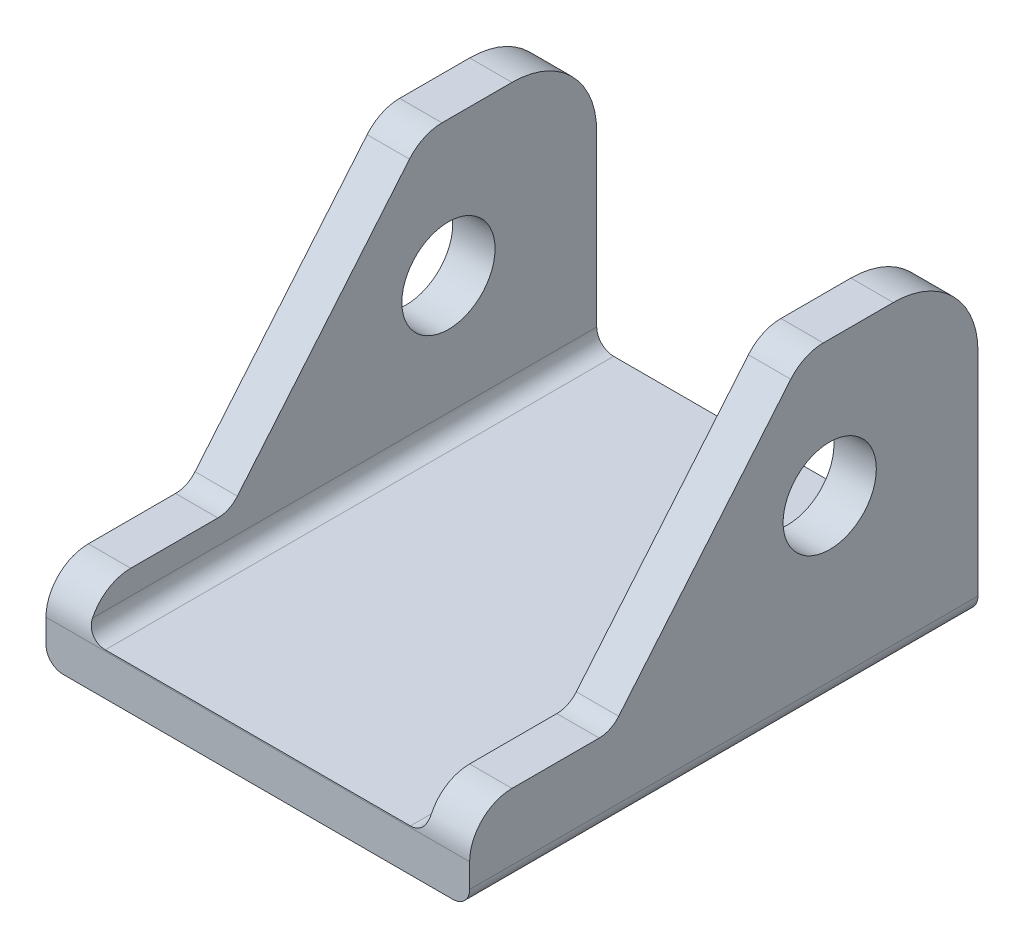
ISO-10303-21;
HEADER;
FILE_DESCRIPTION(('STEP AP214'),'2;1');
FILE_NAME('part.step','',(''),(''),'','','');
FILE_SCHEMA(('AUTOMOTIVE_DESIGN { 1 0 10303 214 1 1 1 1 }'));
ENDSEC;
DATA;
#1=APPLICATION_CONTEXT('core data for automotive mechanical design processes');
#2=APPLICATION_PROTOCOL_DEFINITION('international standard','automotive_design',2000,#1);
#3=PRODUCT_CONTEXT('',#1,'mechanical');
#4=PRODUCT('Part','Part','',(#3));
#5=PRODUCT_RELATED_PRODUCT_CATEGORY('part','',(#4));
#6=PRODUCT_DEFINITION_FORMATION('','',#4);
#7=PRODUCT_DEFINITION_CONTEXT('part definition',#1,'design');
#8=PRODUCT_DEFINITION('design','',#6,#7);
#9=PRODUCT_DEFINITION_SHAPE('','',#8);
#10=(LENGTH_UNIT() NAMED_UNIT(*) SI_UNIT(.MILLI.,.METRE.));
#11=(NAMED_UNIT(*) PLANE_ANGLE_UNIT() SI_UNIT($,.RADIAN.));
#12=(NAMED_UNIT(*) SI_UNIT($,.STERADIAN.) SOLID_ANGLE_UNIT());
#13=UNCERTAINTY_MEASURE_WITH_UNIT(LENGTH_MEASURE(1.E-05),#10,'distance_accuracy_value','');
#14=(GEOMETRIC_REPRESENTATION_CONTEXT(3) GLOBAL_UNCERTAINTY_ASSIGNED_CONTEXT((#13)) GLOBAL_UNIT_ASSIGNED_CONTEXT((#10,
#11,#12)) REPRESENTATION_CONTEXT('',''));
#15=CARTESIAN_POINT('',(0.,0.,0.));
#16=DIRECTION('',(0.,0.,1.));
#17=DIRECTION('',(1.,0.,0.));
#18=AXIS2_PLACEMENT_3D('',#15,#16,#17);
#19=CARTESIAN_POINT('',(-93.9251910485441,-11.2481336624736,60.));
#20=DIRECTION('',(1.,0.,0.));
#21=DIRECTION('',(0.,0.,-1.));
#22=AXIS2_PLACEMENT_3D('',#19,#20,#21);
#23=PLANE('',#22);
#24=CARTESIAN_POINT('',(-93.9251910485441,7.75186633752635,17.5));
#25=DIRECTION('',(1.,0.,0.));
#26=DIRECTION('',(0.,0.,-1.));
#27=AXIS2_PLACEMENT_3D('',#24,#25,#26);
#28=CIRCLE('',#27,5.5);
#29=CARTESIAN_POINT('',(-93.9251910485441,7.75186633752635,12.));
#30=VERTEX_POINT('',#29);
#31=EDGE_CURVE('E338',#30,#30,#28,.T.);
#32=ORIENTED_EDGE('',*,*,#31,.T.);
#33=EDGE_LOOP('',(#32));
#34=FACE_BOUND('',#33,.T.);
#35=CARTESIAN_POINT('',(-93.9251910485441,18.7518663375264,18.2638664890412));
#36=DIRECTION('',(1.,0.,0.));
#37=DIRECTION('',(0.,0.,-1.));
#38=AXIS2_PLACEMENT_3D('',#35,#36,#37);
#39=CIRCLE('',#38,5.);
#40=CARTESIAN_POINT('',(-93.9251910485441,23.7518663375264,18.2638664890412));
#41=VERTEX_POINT('',#40);
#42=CARTESIAN_POINT('',(-93.9251910485441,21.9591391649979,22.0996716209741));
#43=VERTEX_POINT('',#42);
#44=EDGE_CURVE('E332',#41,#43,#39,.T.);
#45=ORIENTED_EDGE('',*,*,#44,.F.);
#46=DIRECTION('',(0.,0.,-1.));
#47=VECTOR('',#46,1.);
#48=CARTESIAN_POINT('',(-93.9251910485441,23.7518663375264,60.));
#49=LINE('',#48,#47);
#50=CARTESIAN_POINT('',(-93.9251910485441,23.7518663375264,10.));
#51=VERTEX_POINT('',#50);
#52=EDGE_CURVE('E413',#41,#51,#49,.T.);
#53=ORIENTED_EDGE('',*,*,#52,.T.);
#54=CARTESIAN_POINT('',(-93.9251910485441,13.7518663375263,10.));
#55=DIRECTION('',(1.,0.,0.));
#56=DIRECTION('',(0.,0.,-1.));
#57=AXIS2_PLACEMENT_3D('',#54,#55,#56);
#58=CIRCLE('',#57,10.);
#59=CARTESIAN_POINT('',(-93.9251910485441,13.7518663375263,0.));
#60=VERTEX_POINT('',#59);
#61=EDGE_CURVE('E311',#51,#60,#58,.F.);
#62=ORIENTED_EDGE('',*,*,#61,.T.);
#63=DIRECTION('',(0.,-1.,0.));
#64=VECTOR('',#63,1.);
#65=CARTESIAN_POINT('',(-93.9251910485441,-11.2481336624736,0.));
#66=LINE('',#65,#64);
#67=CARTESIAN_POINT('',(-93.9251910485441,-11.2481336624736,0.));
#68=VERTEX_POINT('',#67);
#69=EDGE_CURVE('E351',#60,#68,#66,.T.);
#70=ORIENTED_EDGE('',*,*,#69,.T.);
#71=DIRECTION('',(0.,0.,-1.));
#72=VECTOR('',#71,1.);
#73=CARTESIAN_POINT('',(-93.9251910485441,-11.2481336624736,60.));
#74=LINE('',#73,#72);
#75=CARTESIAN_POINT('',(-93.9251910485441,-11.2481336624736,60.));
#76=VERTEX_POINT('',#75);
#77=EDGE_CURVE('E410',#76,#68,#74,.T.);
#78=ORIENTED_EDGE('',*,*,#77,.F.);
#79=DIRECTION('',(0.,-1.,0.));
#80=VECTOR('',#79,1.);
#81=CARTESIAN_POINT('',(-93.9251910485441,-11.2481336624736,60.));
#82=LINE('',#81,#80);
#83=CARTESIAN_POINT('',(-93.9251910485441,-8.40963792703764,60.));
#84=VERTEX_POINT('',#83);
#85=EDGE_CURVE('E352',#84,#76,#82,.T.);
#86=ORIENTED_EDGE('',*,*,#85,.F.);
#87=CARTESIAN_POINT('',(-93.9251910485441,-8.40963792703764,55.));
#88=DIRECTION('',(1.,0.,0.));
#89=DIRECTION('',(0.,0.,-1.));
#90=AXIS2_PLACEMENT_3D('',#87,#88,#89);
#91=CIRCLE('',#90,5.);
#92=CARTESIAN_POINT('',(-93.9251910485441,-3.40963792703763,55.));
#93=VERTEX_POINT('',#92);
#94=EDGE_CURVE('E433',#93,#84,#91,.T.);
#95=ORIENTED_EDGE('',*,*,#94,.F.);
#96=DIRECTION('',(0.,0.,1.));
#97=VECTOR('',#96,1.);
#98=CARTESIAN_POINT('',(-93.9251910485441,-3.40963792703763,60.));
#99=LINE('',#98,#97);
#100=CARTESIAN_POINT('',(-93.9251910485441,-3.40963792703763,44.7136386937328));
#101=VERTEX_POINT('',#100);
#102=EDGE_CURVE('E194',#101,#93,#99,.T.);
#103=ORIENTED_EDGE('',*,*,#102,.F.);
#104=CARTESIAN_POINT('',(-93.9251910485441,-0.409637927037632,44.7136386937328));
#105=DIRECTION('',(1.,0.,0.));
#106=DIRECTION('',(0.,0.,-1.));
#107=AXIS2_PLACEMENT_3D('',#104,#105,#106);
#108=CIRCLE('',#107,3.);
#109=CARTESIAN_POINT('',(-93.9251910485441,-2.33400162352049,42.4121556145731));
#110=VERTEX_POINT('',#109);
#111=EDGE_CURVE('E37',#110,#101,#108,.F.);
#112=ORIENTED_EDGE('',*,*,#111,.F.);
#113=DIRECTION('',(0.,-0.767161026386595,0.641454565494289));
#114=VECTOR('',#113,1.);
#115=CARTESIAN_POINT('',(-93.9251910485441,-16.2352492263774,54.0355546588638));
#116=LINE('',#115,#114);
#117=EDGE_CURVE('E32',#43,#110,#116,.T.);
#118=ORIENTED_EDGE('',*,*,#117,.F.);
#119=EDGE_LOOP('',(#45,#53,#62,#70,#78,#86,#95,#103,#112,#118));
#120=FACE_BOUND('',#119,.T.);
#121=ADVANCED_FACE('F17',(#34,#120),#23,.F.);
#122=CARTESIAN_POINT('',(-43.9251910485441,-11.2481336624736,60.));
#123=DIRECTION('',(-1.,0.,0.));
#124=DIRECTION('',(0.,0.,1.));
#125=AXIS2_PLACEMENT_3D('',#122,#123,#124);
#126=PLANE('',#125);
#127=CARTESIAN_POINT('',(-43.9251910485441,7.75186633752635,17.5));
#128=DIRECTION('',(1.,0.,0.));
#129=DIRECTION('',(0.,0.,-1.));
#130=AXIS2_PLACEMENT_3D('',#127,#128,#129);
#131=CIRCLE('',#130,5.5);
#132=CARTESIAN_POINT('',(-43.9251910485441,7.75186633752635,12.));
#133=VERTEX_POINT('',#132);
#134=EDGE_CURVE('E334',#133,#133,#131,.T.);
#135=ORIENTED_EDGE('',*,*,#134,.F.);
#136=EDGE_LOOP('',(#135));
#137=FACE_BOUND('',#136,.T.);
#138=CARTESIAN_POINT('',(-43.9251910485441,18.7518663375264,18.2638664890412));
#139=DIRECTION('',(-1.,0.,0.));
#140=DIRECTION('',(0.,0.,1.));
#141=AXIS2_PLACEMENT_3D('',#138,#139,#140);
#142=CIRCLE('',#141,5.);
#143=CARTESIAN_POINT('',(-43.9251910485441,21.9591391649979,22.0996716209741));
#144=VERTEX_POINT('',#143);
#145=CARTESIAN_POINT('',(-43.9251910485441,23.7518663375264,18.2638664890412));
#146=VERTEX_POINT('',#145);
#147=EDGE_CURVE('E335',#144,#146,#142,.T.);
#148=ORIENTED_EDGE('',*,*,#147,.F.);
#149=DIRECTION('',(0.,0.767161026386595,-0.641454565494289));
#150=VECTOR('',#149,1.);
#151=CARTESIAN_POINT('',(-43.9251910485441,-16.2352492263774,54.0355546588638));
#152=LINE('',#151,#150);
#153=CARTESIAN_POINT('',(-43.9251910485441,-2.33400162352049,42.4121556145731));
#154=VERTEX_POINT('',#153);
#155=EDGE_CURVE('E453',#154,#144,#152,.T.);
#156=ORIENTED_EDGE('',*,*,#155,.F.);
#157=CARTESIAN_POINT('',(-43.9251910485441,-0.409637927037632,44.7136386937328));
#158=DIRECTION('',(-1.,0.,0.));
#159=DIRECTION('',(0.,0.,1.));
#160=AXIS2_PLACEMENT_3D('',#157,#158,#159);
#161=CIRCLE('',#160,3.);
#162=CARTESIAN_POINT('',(-43.9251910485441,-3.40963792703763,44.7136386937328));
#163=VERTEX_POINT('',#162);
#164=EDGE_CURVE('E446',#163,#154,#161,.F.);
#165=ORIENTED_EDGE('',*,*,#164,.F.);
#166=DIRECTION('',(0.,0.,-1.));
#167=VECTOR('',#166,1.);
#168=CARTESIAN_POINT('',(-43.9251910485441,-3.40963792703763,60.));
#169=LINE('',#168,#167);
#170=CARTESIAN_POINT('',(-43.9251910485441,-3.40963792703763,55.));
#171=VERTEX_POINT('',#170);
#172=EDGE_CURVE('E439',#171,#163,#169,.T.);
#173=ORIENTED_EDGE('',*,*,#172,.F.);
#174=CARTESIAN_POINT('',(-43.9251910485441,-8.40963792703764,55.));
#175=DIRECTION('',(-1.,0.,0.));
#176=DIRECTION('',(0.,0.,1.));
#177=AXIS2_PLACEMENT_3D('',#174,#175,#176);
#178=CIRCLE('',#177,5.);
#179=CARTESIAN_POINT('',(-43.9251910485441,-8.40963792703764,60.));
#180=VERTEX_POINT('',#179);
#181=EDGE_CURVE('E432',#180,#171,#178,.T.);
#182=ORIENTED_EDGE('',*,*,#181,.F.);
#183=DIRECTION('',(0.,1.,0.));
#184=VECTOR('',#183,1.);
#185=CARTESIAN_POINT('',(-43.9251910485441,-11.2481336624736,60.));
#186=LINE('',#185,#184);
#187=CARTESIAN_POINT('',(-43.9251910485441,-11.2481336624736,60.));
#188=VERTEX_POINT('',#187);
#189=EDGE_CURVE('E361',#188,#180,#186,.T.);
#190=ORIENTED_EDGE('',*,*,#189,.F.);
#191=DIRECTION('',(0.,0.,-1.));
#192=VECTOR('',#191,1.);
#193=CARTESIAN_POINT('',(-43.9251910485441,-11.2481336624736,60.));
#194=LINE('',#193,#192);
#195=CARTESIAN_POINT('',(-43.9251910485441,-11.2481336624736,0.));
#196=VERTEX_POINT('',#195);
#197=EDGE_CURVE('E401',#188,#196,#194,.T.);
#198=ORIENTED_EDGE('',*,*,#197,.T.);
#199=DIRECTION('',(0.,1.,0.));
#200=VECTOR('',#199,1.);
#201=CARTESIAN_POINT('',(-43.9251910485441,-11.2481336624736,0.));
#202=LINE('',#201,#200);
#203=CARTESIAN_POINT('',(-43.9251910485441,13.7518663375263,0.));
#204=VERTEX_POINT('',#203);
#205=EDGE_CURVE('E372',#196,#204,#202,.T.);
#206=ORIENTED_EDGE('',*,*,#205,.T.);
#207=CARTESIAN_POINT('',(-43.9251910485441,13.7518663375263,10.));
#208=DIRECTION('',(-1.,0.,0.));
#209=DIRECTION('',(0.,0.,1.));
#210=AXIS2_PLACEMENT_3D('',#207,#208,#209);
#211=CIRCLE('',#210,10.);
#212=CARTESIAN_POINT('',(-43.9251910485441,23.7518663375264,10.));
#213=VERTEX_POINT('',#212);
#214=EDGE_CURVE('E300',#204,#213,#211,.F.);
#215=ORIENTED_EDGE('',*,*,#214,.T.);
#216=DIRECTION('',(0.,0.,-1.));
#217=VECTOR('',#216,1.);
#218=CARTESIAN_POINT('',(-43.9251910485441,23.7518663375264,60.));
#219=LINE('',#218,#217);
#220=EDGE_CURVE('E399',#146,#213,#219,.T.);
#221=ORIENTED_EDGE('',*,*,#220,.F.);
#222=EDGE_LOOP('',(#148,#156,#165,#173,#182,#190,#198,#206,#215,#221));
#223=FACE_BOUND('',#222,.T.);
#224=ADVANCED_FACE('F252',(#137,#223),#126,.F.);
#225=CARTESIAN_POINT('',(-48.9251910485441,-6.24813366247364,60.));
#226=DIRECTION('',(1.,0.,0.));
#227=DIRECTION('',(0.,0.,-1.));
#228=AXIS2_PLACEMENT_3D('',#225,#226,#227);
#229=PLANE('',#228);
#230=CARTESIAN_POINT('',(-48.9251910485441,7.75186633752635,17.5));
#231=DIRECTION('',(1.,0.,0.));
#232=DIRECTION('',(0.,0.,-1.));
#233=AXIS2_PLACEMENT_3D('',#230,#231,#232);
#234=CIRCLE('',#233,5.5);
#235=CARTESIAN_POINT('',(-48.9251910485441,7.75186633752635,12.));
#236=VERTEX_POINT('',#235);
#237=EDGE_CURVE('E347',#236,#236,#234,.T.);
#238=ORIENTED_EDGE('',*,*,#237,.T.);
#239=EDGE_LOOP('',(#238));
#240=FACE_BOUND('',#239,.T.);
#241=CARTESIAN_POINT('',(-48.9251910485441,18.7518663375264,18.2638664890412));
#242=DIRECTION('',(1.,0.,0.));
#243=DIRECTION('',(0.,0.,-1.));
#244=AXIS2_PLACEMENT_3D('',#241,#242,#243);
#245=CIRCLE('',#244,5.);
#246=CARTESIAN_POINT('',(-48.9251910485441,23.7518663375264,18.2638664890412));
#247=VERTEX_POINT('',#246);
#248=CARTESIAN_POINT('',(-48.9251910485441,21.9591391649979,22.0996716209741));
#249=VERTEX_POINT('',#248);
#250=EDGE_CURVE('E341',#247,#249,#245,.T.);
#251=ORIENTED_EDGE('',*,*,#250,.F.);
#252=DIRECTION('',(0.,0.,-1.));
#253=VECTOR('',#252,1.);
#254=CARTESIAN_POINT('',(-48.9251910485441,23.7518663375264,60.));
#255=LINE('',#254,#253);
#256=CARTESIAN_POINT('',(-48.9251910485441,23.7518663375264,10.));
#257=VERTEX_POINT('',#256);
#258=EDGE_CURVE('E397',#247,#257,#255,.T.);
#259=ORIENTED_EDGE('',*,*,#258,.T.);
#260=CARTESIAN_POINT('',(-48.9251910485441,13.7518663375263,10.));
#261=DIRECTION('',(1.,0.,0.));
#262=DIRECTION('',(0.,0.,-1.));
#263=AXIS2_PLACEMENT_3D('',#260,#261,#262);
#264=CIRCLE('',#263,10.);
#265=CARTESIAN_POINT('',(-48.9251910485441,13.7518663375263,0.));
#266=VERTEX_POINT('',#265);
#267=EDGE_CURVE('E313',#257,#266,#264,.F.);
#268=ORIENTED_EDGE('',*,*,#267,.T.);
#269=DIRECTION('',(0.,-1.,0.));
#270=VECTOR('',#269,1.);
#271=CARTESIAN_POINT('',(-48.9251910485441,-6.24813366247364,0.));
#272=LINE('',#271,#270);
#273=CARTESIAN_POINT('',(-48.9251910485441,-6.24813366247365,0.));
#274=VERTEX_POINT('',#273);
#275=EDGE_CURVE('E374',#266,#274,#272,.T.);
#276=ORIENTED_EDGE('',*,*,#275,.T.);
#277=DIRECTION('',(0.,0.,-1.));
#278=VECTOR('',#277,1.);
#279=CARTESIAN_POINT('',(-48.9251910485441,-6.24813366247365,60.));
#280=LINE('',#279,#278);
#281=CARTESIAN_POINT('',(-48.9251910485441,-6.24813366247365,59.5086471711892));
#282=VERTEX_POINT('',#281);
#283=EDGE_CURVE('E395',#282,#274,#280,.T.);
#284=ORIENTED_EDGE('',*,*,#283,.F.);
#285=CARTESIAN_POINT('',(-48.9251910485441,-8.40963792703764,55.));
#286=DIRECTION('',(1.,0.,0.));
#287=DIRECTION('',(0.,0.,-1.));
#288=AXIS2_PLACEMENT_3D('',#285,#286,#287);
#289=CIRCLE('',#288,5.);
#290=CARTESIAN_POINT('',(-48.9251910485441,-3.40963792703763,55.));
#291=VERTEX_POINT('',#290);
#292=EDGE_CURVE('E241',#291,#282,#289,.T.);
#293=ORIENTED_EDGE('',*,*,#292,.F.);
#294=DIRECTION('',(0.,0.,1.));
#295=VECTOR('',#294,1.);
#296=CARTESIAN_POINT('',(-48.9251910485441,-3.40963792703763,60.));
#297=LINE('',#296,#295);
#298=CARTESIAN_POINT('',(-48.9251910485441,-3.40963792703763,44.7136386937328));
#299=VERTEX_POINT('',#298);
#300=EDGE_CURVE('E435',#299,#291,#297,.T.);
#301=ORIENTED_EDGE('',*,*,#300,.F.);
#302=CARTESIAN_POINT('',(-48.9251910485441,-0.409637927037632,44.7136386937328));
#303=DIRECTION('',(1.,0.,0.));
#304=DIRECTION('',(0.,0.,-1.));
#305=AXIS2_PLACEMENT_3D('',#302,#303,#304);
#306=CIRCLE('',#305,3.);
#307=CARTESIAN_POINT('',(-48.9251910485441,-2.33400162352049,42.4121556145731));
#308=VERTEX_POINT('',#307);
#309=EDGE_CURVE('E443',#308,#299,#306,.F.);
#310=ORIENTED_EDGE('',*,*,#309,.F.);
#311=DIRECTION('',(0.,-0.767161026386595,0.641454565494289));
#312=VECTOR('',#311,1.);
#313=CARTESIAN_POINT('',(-48.9251910485441,-13.2925690243447,51.575059944639));
#314=LINE('',#313,#312);
#315=EDGE_CURVE('E450',#249,#308,#314,.T.);
#316=ORIENTED_EDGE('',*,*,#315,.F.);
#317=EDGE_LOOP('',(#251,#259,#268,#276,#284,#293,#301,#310,#316));
#318=FACE_BOUND('',#317,.T.);
#319=ADVANCED_FACE('F248',(#240,#318),#229,.F.);
#320=CARTESIAN_POINT('',(-50.9251910485441,-6.24813366247365,60.));
#321=DIRECTION('',(0.,0.,-1.));
#322=DIRECTION('',(-1.,0.,0.));
#323=AXIS2_PLACEMENT_3D('',#320,#321,#322);
#324=CYLINDRICAL_SURFACE('',#323,2.);
#325=CARTESIAN_POINT('',(-48.9251910485441,-6.24813366247365,59.5086471711892));
#326=CARTESIAN_POINT('',(-48.9251858279575,-6.29925158291448,59.5331623247386));
#327=CARTESIAN_POINT('',(-48.9271512068707,-6.35080301802409,59.5567990272245));
#328=CARTESIAN_POINT('',(-48.9351813542254,-6.45443177630553,59.602211528082));
#329=CARTESIAN_POINT('',(-48.9412481172607,-6.50650934320255,59.6239864152047));
#330=CARTESIAN_POINT('',(-48.9576482900265,-6.61085446674959,59.6655693990258));
#331=CARTESIAN_POINT('',(-48.9679862513358,-6.66312216693958,59.6853753695408));
#332=CARTESIAN_POINT('',(-48.9930137289147,-6.76733290544828,59.7229131946399));
#333=CARTESIAN_POINT('',(-49.0077024703024,-6.81927599989918,59.7406454177785));
#334=CARTESIAN_POINT('',(-49.0585115706969,-6.97430059994172,59.7907790495722));
#335=CARTESIAN_POINT('',(-49.1013362318181,-7.07632240709125,59.8200169471264));
#336=CARTESIAN_POINT('',(-49.2042792554828,-7.27322030647919,59.8702058638572));
#337=CARTESIAN_POINT('',(-49.2643756509398,-7.36810528350626,59.8911673295423));
#338=CARTESIAN_POINT('',(-49.3970308688227,-7.54279772429904,59.9250504742515));
#339=CARTESIAN_POINT('',(-49.4688265198361,-7.62311873332182,59.9383184475654));
#340=CARTESIAN_POINT('',(-49.6248376640662,-7.77151129368797,59.9596805565256));
#341=CARTESIAN_POINT('',(-49.7090594765108,-7.83957657313861,59.9677720484745));
#342=CARTESIAN_POINT('',(-49.8881051774762,-7.96168873087448,59.9802757420668));
#343=CARTESIAN_POINT('',(-49.982990863911,-8.01564716216322,59.9846650966699));
#344=CARTESIAN_POINT('',(-50.1803233596858,-8.1074372234226,59.9910713392174));
#345=CARTESIAN_POINT('',(-50.2827684441001,-8.14527251915008,59.993088766627));
#346=CARTESIAN_POINT('',(-50.4749979127184,-8.19891859416786,59.9956202169407));
#347=CARTESIAN_POINT('',(-50.5640614480152,-8.21734265358092,59.9963281951281));
#348=CARTESIAN_POINT('',(-50.7438048210362,-8.24196347177262,59.9971908023903));
#349=CARTESIAN_POINT('',(-50.8344835569718,-8.24816826602772,59.9973457951667));
#350=CARTESIAN_POINT('',(-50.9251910485441,-8.24813366247365,59.997390956542));
#351=B_SPLINE_CURVE_WITH_KNOTS('',3,(#325,#326,#327,#328,#329,#330,#331,#332,#333,#334,#335,
#336,#337,#338,#339,#340,#341,#342,#343,#344,#345,#346,#347,#348,#349,#350),.UNSPECIFIED.,.F.,
.F.,(4,2,2,2,2,2,2,2,2,2,2,2,4),(0.,0.170050316121905,0.340183391021309,0.510498236842742,
0.680782767500124,1.02217120620495,1.36312735645558,1.6872241414251,2.0114863150445,
2.3377352664318,2.66391000221573,2.93594663159864,3.20780430792562),.UNSPECIFIED.);
#352=CARTESIAN_POINT('',(-50.9251910485441,-8.24813366247365,59.997390956542));
#353=VERTEX_POINT('',#352);
#354=EDGE_CURVE('E233',#282,#353,#351,.T.);
#355=ORIENTED_EDGE('',*,*,#354,.F.);
#356=ORIENTED_EDGE('',*,*,#283,.T.);
#357=CARTESIAN_POINT('',(-50.9251910485441,-6.24813366247365,0.));
#358=DIRECTION('',(0.,0.,-1.));
#359=DIRECTION('',(1.,0.,0.));
#360=AXIS2_PLACEMENT_3D('',#357,#358,#359);
#361=CIRCLE('',#360,2.);
#362=CARTESIAN_POINT('',(-50.9251910485441,-8.24813366247365,0.));
#363=VERTEX_POINT('',#362);
#364=EDGE_CURVE('E377',#274,#363,#361,.T.);
#365=ORIENTED_EDGE('',*,*,#364,.T.);
#366=DIRECTION('',(0.,0.,-1.));
#367=VECTOR('',#366,1.);
#368=CARTESIAN_POINT('',(-50.9251910485441,-8.24813366247365,60.));
#369=LINE('',#368,#367);
#370=EDGE_CURVE('E393',#353,#363,#369,.T.);
#371=ORIENTED_EDGE('',*,*,#370,.F.);
#372=EDGE_LOOP('',(#355,#356,#365,#371));
#373=FACE_BOUND('',#372,.T.);
#374=ADVANCED_FACE('F243',(#373),#324,.F.);
#375=CARTESIAN_POINT('',(-86.9251910485441,-8.24813366247365,60.));
#376=DIRECTION('',(0.,-1.,0.));
#377=DIRECTION('',(0.,0.,-1.));
#378=AXIS2_PLACEMENT_3D('',#375,#376,#377);
#379=PLANE('',#378);
#380=DIRECTION('',(1.,0.,0.));
#381=VECTOR('',#380,1.);
#382=CARTESIAN_POINT('',(-201.954411632607,-8.24813366247365,59.997390956542));
#383=LINE('',#382,#381);
#384=CARTESIAN_POINT('',(-86.9251910485441,-8.24813366247365,59.997390956542));
#385=VERTEX_POINT('',#384);
#386=EDGE_CURVE('E221',#353,#385,#383,.F.);
#387=ORIENTED_EDGE('',*,*,#386,.F.);
#388=ORIENTED_EDGE('',*,*,#370,.T.);
#389=DIRECTION('',(-1.,0.,0.));
#390=VECTOR('',#389,1.);
#391=CARTESIAN_POINT('',(-86.9251910485441,-8.24813366247365,0.));
#392=LINE('',#391,#390);
#393=CARTESIAN_POINT('',(-86.9251910485441,-8.24813366247365,0.));
#394=VERTEX_POINT('',#393);
#395=EDGE_CURVE('E380',#363,#394,#392,.T.);
#396=ORIENTED_EDGE('',*,*,#395,.T.);
#397=DIRECTION('',(0.,0.,-1.));
#398=VECTOR('',#397,1.);
#399=CARTESIAN_POINT('',(-86.9251910485441,-8.24813366247365,60.));
#400=LINE('',#399,#398);
#401=EDGE_CURVE('E391',#385,#394,#400,.T.);
#402=ORIENTED_EDGE('',*,*,#401,.F.);
#403=EDGE_LOOP('',(#387,#388,#396,#402));
#404=FACE_BOUND('',#403,.T.);
#405=ADVANCED_FACE('F247',(#404),#379,.F.);
#406=CARTESIAN_POINT('',(-86.9251910485441,-6.24813366247365,60.));
#407=DIRECTION('',(0.,0.,-1.));
#408=DIRECTION('',(-1.,0.,0.));
#409=AXIS2_PLACEMENT_3D('',#406,#407,#408);
#410=CYLINDRICAL_SURFACE('',#409,2.);
#411=CARTESIAN_POINT('',(-86.9251910485441,-8.24813366247365,59.997390956542));
#412=CARTESIAN_POINT('',(-86.9812711668975,-8.24813327190804,59.9973855418155));
#413=CARTESIAN_POINT('',(-87.0373245218461,-8.24577343707318,59.9973152911568));
#414=CARTESIAN_POINT('',(-87.1490332400256,-8.23635895740011,59.9969998076121));
#415=CARTESIAN_POINT('',(-87.2046886155049,-8.22930445768086,59.9967545801348));
#416=CARTESIAN_POINT('',(-87.3704058709195,-8.20115871113856,59.9956893695155));
#417=CARTESIAN_POINT('',(-87.4793630818956,-8.17308507890719,59.9945400739284));
#418=CARTESIAN_POINT('',(-87.6910287339406,-8.09910257991013,59.9904834356634));
#419=CARTESIAN_POINT('',(-87.793733264834,-8.05318268266771,59.9875750050739));
#420=CARTESIAN_POINT('',(-87.9899107151172,-7.9448696866811,59.9786475487792));
#421=CARTESIAN_POINT('',(-88.0833855363495,-7.88247999142165,59.9726291655002));
#422=CARTESIAN_POINT('',(-88.2576426881013,-7.74375261547649,59.9559481940563));
#423=CARTESIAN_POINT('',(-88.338520998429,-7.66753107555156,59.9453233235515));
#424=CARTESIAN_POINT('',(-88.4860987217871,-7.50341577601852,59.9178917468544));
#425=CARTESIAN_POINT('',(-88.5528048122846,-7.41552754521566,59.9010879621928));
#426=CARTESIAN_POINT('',(-88.6688052072329,-7.23360526141878,59.8605965957802));
#427=CARTESIAN_POINT('',(-88.7184987296861,-7.13978401029802,59.8370947007016));
#428=CARTESIAN_POINT('',(-88.8019251200691,-6.94733011365626,59.7824319127127));
#429=CARTESIAN_POINT('',(-88.8356474086825,-6.84869432656982,59.7512659638506));
#430=CARTESIAN_POINT('',(-88.8830580621364,-6.66557519735472,59.6868058543229));
#431=CARTESIAN_POINT('',(-88.8990558800358,-6.58129294880389,59.6546081816976));
#432=CARTESIAN_POINT('',(-88.9148540030958,-6.45555936360916,59.6025686270406));
#433=CARTESIAN_POINT('',(-88.9187537568442,-6.41379567462461,59.5846138397826));
#434=CARTESIAN_POINT('',(-88.9239222189301,-6.33064414444079,59.5475113940814));
#435=CARTESIAN_POINT('',(-88.9251913539992,-6.28925624336694,59.5283639296301));
#436=CARTESIAN_POINT('',(-88.9251910485441,-6.24813366247363,59.5086471711892));
#437=B_SPLINE_CURVE_WITH_KNOTS('',3,(#411,#412,#413,#414,#415,#416,#417,#418,#419,#420,#421,
#422,#423,#424,#425,#426,#427,#428,#429,#430,#431,#432,#433,#434,#435,#436),.UNSPECIFIED.,.F.,
.F.,(4,2,2,2,2,2,2,2,2,2,2,2,4),(0.,0.168137462911734,0.336269728690167,0.672107132004759,
1.00815244175132,1.34412836200259,1.67740380015729,2.01052186032119,2.33517884675303,
2.66005058564635,2.93407719960667,3.07087572360897,3.20765205480591),.UNSPECIFIED.);
#438=CARTESIAN_POINT('',(-88.9251910485441,-6.24813366247364,59.5086471711892));
#439=VERTEX_POINT('',#438);
#440=EDGE_CURVE('E189',#385,#439,#437,.T.);
#441=ORIENTED_EDGE('',*,*,#440,.F.);
#442=ORIENTED_EDGE('',*,*,#401,.T.);
#443=CARTESIAN_POINT('',(-86.9251910485441,-6.24813366247365,0.));
#444=DIRECTION('',(0.,0.,-1.));
#445=DIRECTION('',(-1.,0.,0.));
#446=AXIS2_PLACEMENT_3D('',#443,#444,#445);
#447=CIRCLE('',#446,2.);
#448=CARTESIAN_POINT('',(-88.9251910485441,-6.24813366247364,0.));
#449=VERTEX_POINT('',#448);
#450=EDGE_CURVE('E383',#394,#449,#447,.T.);
#451=ORIENTED_EDGE('',*,*,#450,.T.);
#452=DIRECTION('',(0.,0.,-1.));
#453=VECTOR('',#452,1.);
#454=CARTESIAN_POINT('',(-88.9251910485441,-6.24813366247364,60.));
#455=LINE('',#454,#453);
#456=EDGE_CURVE('E389',#439,#449,#455,.T.);
#457=ORIENTED_EDGE('',*,*,#456,.F.);
#458=EDGE_LOOP('',(#441,#442,#451,#457));
#459=FACE_BOUND('',#458,.T.);
#460=ADVANCED_FACE('F223',(#459),#410,.F.);
#461=CARTESIAN_POINT('',(-88.9251910485441,-6.24813366247364,60.));
#462=DIRECTION('',(-1.,0.,0.));
#463=DIRECTION('',(0.,0.,1.));
#464=AXIS2_PLACEMENT_3D('',#461,#462,#463);
#465=PLANE('',#464);
#466=CARTESIAN_POINT('',(-88.9251910485441,7.75186633752635,17.5));
#467=DIRECTION('',(-1.,0.,0.));
#468=DIRECTION('',(0.,0.,1.));
#469=AXIS2_PLACEMENT_3D('',#466,#467,#468);
#470=CIRCLE('',#469,5.5);
#471=CARTESIAN_POINT('',(-88.9251910485441,7.75186633752635,23.));
#472=VERTEX_POINT('',#471);
#473=EDGE_CURVE('E348',#472,#472,#470,.T.);
#474=ORIENTED_EDGE('',*,*,#473,.T.);
#475=EDGE_LOOP('',(#474));
#476=FACE_BOUND('',#475,.T.);
#477=CARTESIAN_POINT('',(-88.9251910485441,18.7518663375264,18.2638664890412));
#478=DIRECTION('',(-1.,0.,0.));
#479=DIRECTION('',(0.,0.,1.));
#480=AXIS2_PLACEMENT_3D('',#477,#478,#479);
#481=CIRCLE('',#480,5.);
#482=CARTESIAN_POINT('',(-88.9251910485441,21.9591391649979,22.0996716209741));
#483=VERTEX_POINT('',#482);
#484=CARTESIAN_POINT('',(-88.9251910485441,23.7518663375264,18.2638664890412));
#485=VERTEX_POINT('',#484);
#486=EDGE_CURVE('E11',#483,#485,#481,.T.);
#487=ORIENTED_EDGE('',*,*,#486,.F.);
#488=DIRECTION('',(0.,0.767161026386595,-0.641454565494289));
#489=VECTOR('',#488,1.);
#490=CARTESIAN_POINT('',(-88.9251910485441,-13.2925690243447,51.575059944639));
#491=LINE('',#490,#489);
#492=CARTESIAN_POINT('',(-88.9251910485441,-2.33400162352049,42.4121556145731));
#493=VERTEX_POINT('',#492);
#494=EDGE_CURVE('E25',#493,#483,#491,.T.);
#495=ORIENTED_EDGE('',*,*,#494,.F.);
#496=CARTESIAN_POINT('',(-88.9251910485441,-0.409637927037632,44.7136386937328));
#497=DIRECTION('',(-1.,0.,0.));
#498=DIRECTION('',(0.,0.,1.));
#499=AXIS2_PLACEMENT_3D('',#496,#497,#498);
#500=CIRCLE('',#499,3.);
#501=CARTESIAN_POINT('',(-88.9251910485441,-3.40963792703763,44.7136386937328));
#502=VERTEX_POINT('',#501);
#503=EDGE_CURVE('E175',#502,#493,#500,.F.);
#504=ORIENTED_EDGE('',*,*,#503,.F.);
#505=DIRECTION('',(0.,0.,-1.));
#506=VECTOR('',#505,1.);
#507=CARTESIAN_POINT('',(-88.9251910485441,-3.40963792703763,60.));
#508=LINE('',#507,#506);
#509=CARTESIAN_POINT('',(-88.9251910485441,-3.40963792703763,55.));
#510=VERTEX_POINT('',#509);
#511=EDGE_CURVE('E169',#510,#502,#508,.T.);
#512=ORIENTED_EDGE('',*,*,#511,.F.);
#513=CARTESIAN_POINT('',(-88.9251910485441,-8.40963792703764,55.));
#514=DIRECTION('',(-1.,0.,0.));
#515=DIRECTION('',(0.,0.,1.));
#516=AXIS2_PLACEMENT_3D('',#513,#514,#515);
#517=CIRCLE('',#516,5.);
#518=EDGE_CURVE('E172',#439,#510,#517,.T.);
#519=ORIENTED_EDGE('',*,*,#518,.F.);
#520=ORIENTED_EDGE('',*,*,#456,.T.);
#521=DIRECTION('',(0.,1.,0.));
#522=VECTOR('',#521,1.);
#523=CARTESIAN_POINT('',(-88.9251910485441,-6.24813366247364,0.));
#524=LINE('',#523,#522);
#525=CARTESIAN_POINT('',(-88.9251910485441,13.7518663375263,0.));
#526=VERTEX_POINT('',#525);
#527=EDGE_CURVE('E355',#449,#526,#524,.T.);
#528=ORIENTED_EDGE('',*,*,#527,.T.);
#529=CARTESIAN_POINT('',(-88.9251910485441,13.7518663375263,10.));
#530=DIRECTION('',(-1.,0.,0.));
#531=DIRECTION('',(0.,0.,1.));
#532=AXIS2_PLACEMENT_3D('',#529,#530,#531);
#533=CIRCLE('',#532,10.);
#534=CARTESIAN_POINT('',(-88.9251910485441,23.7518663375264,10.));
#535=VERTEX_POINT('',#534);
#536=EDGE_CURVE('E320',#526,#535,#533,.F.);
#537=ORIENTED_EDGE('',*,*,#536,.T.);
#538=DIRECTION('',(0.,0.,-1.));
#539=VECTOR('',#538,1.);
#540=CARTESIAN_POINT('',(-88.9251910485441,23.7518663375264,60.));
#541=LINE('',#540,#539);
#542=EDGE_CURVE('E364',#485,#535,#541,.T.);
#543=ORIENTED_EDGE('',*,*,#542,.F.);
#544=EDGE_LOOP('',(#487,#495,#504,#512,#519,#520,#528,#537,#543));
#545=FACE_BOUND('',#544,.T.);
#546=ADVANCED_FACE('F171',(#476,#545),#465,.F.);
#547=CARTESIAN_POINT('',(-86.9251910485441,-6.24813366247365,60.));
#548=DIRECTION('',(0.,0.,-1.));
#549=DIRECTION('',(-1.,0.,0.));
#550=AXIS2_PLACEMENT_3D('',#547,#548,#549);
#551=PLANE('',#550);
#552=CARTESIAN_POINT('',(-45.9251910485441,-11.2481336624736,60.));
#553=DIRECTION('',(0.,0.,1.));
#554=DIRECTION('',(1.,0.,0.));
#555=AXIS2_PLACEMENT_3D('',#552,#553,#554);
#556=CIRCLE('',#555,2.);
#557=CARTESIAN_POINT('',(-45.9251910485441,-13.2481336624736,60.));
#558=VERTEX_POINT('',#557);
#559=EDGE_CURVE('E359',#558,#188,#556,.T.);
#560=ORIENTED_EDGE('',*,*,#559,.T.);
#561=ORIENTED_EDGE('',*,*,#189,.T.);
#562=DIRECTION('',(1.,0.,0.));
#563=VECTOR('',#562,1.);
#564=CARTESIAN_POINT('',(-201.954411632607,-8.40963792703764,60.));
#565=LINE('',#564,#563);
#566=EDGE_CURVE('E180',#84,#180,#565,.T.);
#567=ORIENTED_EDGE('',*,*,#566,.F.);
#568=ORIENTED_EDGE('',*,*,#85,.T.);
#569=CARTESIAN_POINT('',(-91.9251910485441,-11.2481336624736,60.));
#570=DIRECTION('',(0.,0.,1.));
#571=DIRECTION('',(-1.,0.,0.));
#572=AXIS2_PLACEMENT_3D('',#569,#570,#571);
#573=CIRCLE('',#572,2.);
#574=CARTESIAN_POINT('',(-91.9251910485441,-13.2481336624736,60.));
#575=VERTEX_POINT('',#574);
#576=EDGE_CURVE('E354',#76,#575,#573,.T.);
#577=ORIENTED_EDGE('',*,*,#576,.T.);
#578=DIRECTION('',(1.,0.,0.));
#579=VECTOR('',#578,1.);
#580=CARTESIAN_POINT('',(-91.9251910485441,-13.2481336624736,60.));
#581=LINE('',#580,#579);
#582=EDGE_CURVE('E357',#575,#558,#581,.T.);
#583=ORIENTED_EDGE('',*,*,#582,.T.);
#584=EDGE_LOOP('',(#560,#561,#567,#568,#577,#583));
#585=FACE_BOUND('',#584,.T.);
#586=ADVANCED_FACE('F279',(#585),#551,.F.);
#587=CARTESIAN_POINT('',(-93.9251910485441,23.7518663375264,60.));
#588=DIRECTION('',(0.,-1.,0.));
#589=DIRECTION('',(0.,0.,-1.));
#590=AXIS2_PLACEMENT_3D('',#587,#588,#589);
#591=PLANE('',#590);
#592=ORIENTED_EDGE('',*,*,#52,.F.);
#593=DIRECTION('',(1.,0.,0.));
#594=VECTOR('',#593,1.);
#595=CARTESIAN_POINT('',(-201.954411632607,23.7518663375265,18.2638664890412));
#596=LINE('',#595,#594);
#597=EDGE_CURVE('E190',#41,#485,#596,.T.);
#598=ORIENTED_EDGE('',*,*,#597,.T.);
#599=ORIENTED_EDGE('',*,*,#542,.T.);
#600=DIRECTION('',(-1.,0.,0.));
#601=VECTOR('',#600,1.);
#602=CARTESIAN_POINT('',(-93.9251910485441,23.7518663375264,10.));
#603=LINE('',#602,#601);
#604=EDGE_CURVE('E308',#535,#51,#603,.T.);
#605=ORIENTED_EDGE('',*,*,#604,.T.);
#606=EDGE_LOOP('',(#592,#598,#599,#605));
#607=FACE_BOUND('',#606,.T.);
#608=ADVANCED_FACE('F273',(#607),#591,.F.);
#609=CARTESIAN_POINT('',(-91.9251910485441,-11.2481336624736,60.));
#610=DIRECTION('',(0.,0.,-1.));
#611=DIRECTION('',(-1.,0.,0.));
#612=AXIS2_PLACEMENT_3D('',#609,#610,#611);
#613=CYLINDRICAL_SURFACE('',#612,2.);
#614=CARTESIAN_POINT('',(-91.9251910485441,-11.2481336624736,0.));
#615=DIRECTION('',(0.,0.,1.));
#616=DIRECTION('',(-1.,0.,0.));
#617=AXIS2_PLACEMENT_3D('',#614,#615,#616);
#618=CIRCLE('',#617,2.);
#619=CARTESIAN_POINT('',(-91.9251910485441,-13.2481336624736,0.));
#620=VERTEX_POINT('',#619);
#621=EDGE_CURVE('E366',#68,#620,#618,.T.);
#622=ORIENTED_EDGE('',*,*,#621,.T.);
#623=DIRECTION('',(0.,0.,-1.));
#624=VECTOR('',#623,1.);
#625=CARTESIAN_POINT('',(-91.9251910485441,-13.2481336624736,60.));
#626=LINE('',#625,#624);
#627=EDGE_CURVE('E407',#575,#620,#626,.T.);
#628=ORIENTED_EDGE('',*,*,#627,.F.);
#629=ORIENTED_EDGE('',*,*,#576,.F.);
#630=ORIENTED_EDGE('',*,*,#77,.T.);
#631=EDGE_LOOP('',(#622,#628,#629,#630));
#632=FACE_BOUND('',#631,.T.);
#633=ADVANCED_FACE('F269',(#632),#613,.T.);
#634=CARTESIAN_POINT('',(-91.9251910485441,-13.2481336624736,60.));
#635=DIRECTION('',(0.,1.,0.));
#636=DIRECTION('',(0.,0.,1.));
#637=AXIS2_PLACEMENT_3D('',#634,#635,#636);
#638=PLANE('',#637);
#639=DIRECTION('',(1.,0.,0.));
#640=VECTOR('',#639,1.);
#641=CARTESIAN_POINT('',(-91.9251910485441,-13.2481336624736,0.));
#642=LINE('',#641,#640);
#643=CARTESIAN_POINT('',(-45.9251910485441,-13.2481336624736,0.));
#644=VERTEX_POINT('',#643);
#645=EDGE_CURVE('E368',#620,#644,#642,.T.);
#646=ORIENTED_EDGE('',*,*,#645,.T.);
#647=DIRECTION('',(0.,0.,-1.));
#648=VECTOR('',#647,1.);
#649=CARTESIAN_POINT('',(-45.9251910485441,-13.2481336624736,60.));
#650=LINE('',#649,#648);
#651=EDGE_CURVE('E404',#558,#644,#650,.T.);
#652=ORIENTED_EDGE('',*,*,#651,.F.);
#653=ORIENTED_EDGE('',*,*,#582,.F.);
#654=ORIENTED_EDGE('',*,*,#627,.T.);
#655=EDGE_LOOP('',(#646,#652,#653,#654));
#656=FACE_BOUND('',#655,.T.);
#657=ADVANCED_FACE('F265',(#656),#638,.F.);
#658=CARTESIAN_POINT('',(-45.9251910485441,-11.2481336624736,60.));
#659=DIRECTION('',(0.,0.,-1.));
#660=DIRECTION('',(-1.,0.,0.));
#661=AXIS2_PLACEMENT_3D('',#658,#659,#660);
#662=CYLINDRICAL_SURFACE('',#661,2.);
#663=CARTESIAN_POINT('',(-45.9251910485441,-11.2481336624736,0.));
#664=DIRECTION('',(0.,0.,1.));
#665=DIRECTION('',(1.,0.,0.));
#666=AXIS2_PLACEMENT_3D('',#663,#664,#665);
#667=CIRCLE('',#666,2.);
#668=EDGE_CURVE('E370',#644,#196,#667,.T.);
#669=ORIENTED_EDGE('',*,*,#668,.T.);
#670=ORIENTED_EDGE('',*,*,#197,.F.);
#671=ORIENTED_EDGE('',*,*,#559,.F.);
#672=ORIENTED_EDGE('',*,*,#651,.T.);
#673=EDGE_LOOP('',(#669,#670,#671,#672));
#674=FACE_BOUND('',#673,.T.);
#675=ADVANCED_FACE('F258',(#674),#662,.T.);
#676=CARTESIAN_POINT('',(-48.9251910485441,23.7518663375264,60.));
#677=DIRECTION('',(0.,-1.,0.));
#678=DIRECTION('',(0.,0.,-1.));
#679=AXIS2_PLACEMENT_3D('',#676,#677,#678);
#680=PLANE('',#679);
#681=ORIENTED_EDGE('',*,*,#258,.F.);
#682=EDGE_CURVE('E212',#247,#146,#596,.T.);
#683=ORIENTED_EDGE('',*,*,#682,.T.);
#684=ORIENTED_EDGE('',*,*,#220,.T.);
#685=DIRECTION('',(-1.,0.,0.));
#686=VECTOR('',#685,1.);
#687=CARTESIAN_POINT('',(-48.9251910485441,23.7518663375264,10.));
#688=LINE('',#687,#686);
#689=EDGE_CURVE('E304',#213,#257,#688,.T.);
#690=ORIENTED_EDGE('',*,*,#689,.T.);
#691=EDGE_LOOP('',(#681,#683,#684,#690));
#692=FACE_BOUND('',#691,.T.);
#693=ADVANCED_FACE('F254',(#692),#680,.F.);
#694=CARTESIAN_POINT('',(-86.9251910485441,-6.24813366247365,0.));
#695=DIRECTION('',(0.,0.,-1.));
#696=DIRECTION('',(-1.,0.,0.));
#697=AXIS2_PLACEMENT_3D('',#694,#695,#696);
#698=PLANE('',#697);
#699=ORIENTED_EDGE('',*,*,#69,.F.);
#700=DIRECTION('',(-1.,0.,0.));
#701=VECTOR('',#700,1.);
#702=CARTESIAN_POINT('',(-88.9251910485441,13.7518663375263,0.));
#703=LINE('',#702,#701);
#704=EDGE_CURVE('E318',#60,#526,#703,.F.);
#705=ORIENTED_EDGE('',*,*,#704,.T.);
#706=ORIENTED_EDGE('',*,*,#527,.F.);
#707=ORIENTED_EDGE('',*,*,#450,.F.);
#708=ORIENTED_EDGE('',*,*,#395,.F.);
#709=ORIENTED_EDGE('',*,*,#364,.F.);
#710=ORIENTED_EDGE('',*,*,#275,.F.);
#711=DIRECTION('',(-1.,0.,0.));
#712=VECTOR('',#711,1.);
#713=CARTESIAN_POINT('',(-43.9251910485441,13.7518663375263,0.));
#714=LINE('',#713,#712);
#715=EDGE_CURVE('E302',#266,#204,#714,.F.);
#716=ORIENTED_EDGE('',*,*,#715,.T.);
#717=ORIENTED_EDGE('',*,*,#205,.F.);
#718=ORIENTED_EDGE('',*,*,#668,.F.);
#719=ORIENTED_EDGE('',*,*,#645,.F.);
#720=ORIENTED_EDGE('',*,*,#621,.F.);
#721=EDGE_LOOP('',(#699,#705,#706,#707,#708,#709,#710,#716,#717,#718,#719,#720));
#722=FACE_BOUND('',#721,.T.);
#723=ADVANCED_FACE('F257',(#722),#698,.T.);
#724=CARTESIAN_POINT('',(-43.9251910485441,7.75186633752635,17.5));
#725=DIRECTION('',(1.,0.,0.));
#726=DIRECTION('',(0.,0.,-1.));
#727=AXIS2_PLACEMENT_3D('',#724,#725,#726);
#728=CYLINDRICAL_SURFACE('',#727,5.5);
#729=ORIENTED_EDGE('',*,*,#134,.T.);
#730=EDGE_LOOP('',(#729));
#731=FACE_BOUND('',#730,.T.);
#732=ORIENTED_EDGE('',*,*,#237,.F.);
#733=EDGE_LOOP('',(#732));
#734=FACE_BOUND('',#733,.T.);
#735=ADVANCED_FACE('F293',(#731,#734),#728,.F.);
#736=ORIENTED_EDGE('',*,*,#31,.F.);
#737=EDGE_LOOP('',(#736));
#738=FACE_BOUND('',#737,.T.);
#739=ORIENTED_EDGE('',*,*,#473,.F.);
#740=EDGE_LOOP('',(#739));
#741=FACE_BOUND('',#740,.T.);
#742=ADVANCED_FACE('F283',(#738,#741),#728,.F.);
#743=CARTESIAN_POINT('',(-48.9251910485441,13.7518663375263,10.));
#744=DIRECTION('',(1.,0.,0.));
#745=DIRECTION('',(0.,0.,-1.));
#746=AXIS2_PLACEMENT_3D('',#743,#744,#745);
#747=CYLINDRICAL_SURFACE('',#746,10.);
#748=ORIENTED_EDGE('',*,*,#214,.F.);
#749=ORIENTED_EDGE('',*,*,#715,.F.);
#750=ORIENTED_EDGE('',*,*,#267,.F.);
#751=ORIENTED_EDGE('',*,*,#689,.F.);
#752=EDGE_LOOP('',(#748,#749,#750,#751));
#753=FACE_BOUND('',#752,.T.);
#754=ADVANCED_FACE('F281',(#753),#747,.T.);
#755=CARTESIAN_POINT('',(-93.9251910485441,13.7518663375263,10.));
#756=DIRECTION('',(1.,0.,0.));
#757=DIRECTION('',(0.,0.,-1.));
#758=AXIS2_PLACEMENT_3D('',#755,#756,#757);
#759=CYLINDRICAL_SURFACE('',#758,10.);
#760=ORIENTED_EDGE('',*,*,#536,.F.);
#761=ORIENTED_EDGE('',*,*,#704,.F.);
#762=ORIENTED_EDGE('',*,*,#61,.F.);
#763=ORIENTED_EDGE('',*,*,#604,.F.);
#764=EDGE_LOOP('',(#760,#761,#762,#763));
#765=FACE_BOUND('',#764,.T.);
#766=ADVANCED_FACE('F19',(#765),#759,.T.);
#767=CARTESIAN_POINT('',(-201.954411632607,18.7518663375264,18.2638664890412));
#768=DIRECTION('',(1.,0.,0.));
#769=DIRECTION('',(0.,0.,-1.));
#770=AXIS2_PLACEMENT_3D('',#767,#768,#769);
#771=CYLINDRICAL_SURFACE('',#770,5.);
#772=ORIENTED_EDGE('',*,*,#597,.F.);
#773=ORIENTED_EDGE('',*,*,#44,.T.);
#774=DIRECTION('',(1.,0.,0.));
#775=VECTOR('',#774,1.);
#776=CARTESIAN_POINT('',(-201.954411632607,21.9591391649979,22.0996716209741));
#777=LINE('',#776,#775);
#778=EDGE_CURVE('E211',#43,#483,#777,.T.);
#779=ORIENTED_EDGE('',*,*,#778,.T.);
#780=ORIENTED_EDGE('',*,*,#486,.T.);
#781=EDGE_LOOP('',(#772,#773,#779,#780));
#782=FACE_BOUND('',#781,.T.);
#783=ADVANCED_FACE('F291',(#782),#771,.T.);
#784=EDGE_CURVE('E208',#249,#144,#777,.T.);
#785=ORIENTED_EDGE('',*,*,#784,.T.);
#786=ORIENTED_EDGE('',*,*,#147,.T.);
#787=ORIENTED_EDGE('',*,*,#682,.F.);
#788=ORIENTED_EDGE('',*,*,#250,.T.);
#789=EDGE_LOOP('',(#785,#786,#787,#788));
#790=FACE_BOUND('',#789,.T.);
#791=ADVANCED_FACE('F460',(#790),#771,.T.);
#792=CARTESIAN_POINT('',(-201.954411632607,21.9591391649979,22.0996716209741));
#793=DIRECTION('',(0.,0.641454565494289,0.767161026386595));
#794=DIRECTION('',(0.,-0.767161026386595,0.641454565494289));
#795=AXIS2_PLACEMENT_3D('',#792,#793,#794);
#796=PLANE('',#795);
#797=ORIENTED_EDGE('',*,*,#778,.F.);
#798=ORIENTED_EDGE('',*,*,#117,.T.);
#799=DIRECTION('',(1.,0.,0.));
#800=VECTOR('',#799,1.);
#801=CARTESIAN_POINT('',(-201.954411632607,-2.33400162352049,42.4121556145731));
#802=LINE('',#801,#800);
#803=EDGE_CURVE('E207',#110,#493,#802,.T.);
#804=ORIENTED_EDGE('',*,*,#803,.T.);
#805=ORIENTED_EDGE('',*,*,#494,.T.);
#806=EDGE_LOOP('',(#797,#798,#804,#805));
#807=FACE_BOUND('',#806,.T.);
#808=ADVANCED_FACE('F328',(#807),#796,.T.);
#809=EDGE_CURVE('E204',#308,#154,#802,.T.);
#810=ORIENTED_EDGE('',*,*,#809,.T.);
#811=ORIENTED_EDGE('',*,*,#155,.T.);
#812=ORIENTED_EDGE('',*,*,#784,.F.);
#813=ORIENTED_EDGE('',*,*,#315,.T.);
#814=EDGE_LOOP('',(#810,#811,#812,#813));
#815=FACE_BOUND('',#814,.T.);
#816=ADVANCED_FACE('F462',(#815),#796,.T.);
#817=CARTESIAN_POINT('',(-201.954411632607,-0.409637927037632,44.7136386937328));
#818=DIRECTION('',(1.,0.,0.));
#819=DIRECTION('',(0.,0.,-1.));
#820=AXIS2_PLACEMENT_3D('',#817,#818,#819);
#821=CYLINDRICAL_SURFACE('',#820,3.);
#822=ORIENTED_EDGE('',*,*,#803,.F.);
#823=ORIENTED_EDGE('',*,*,#111,.T.);
#824=DIRECTION('',(1.,0.,0.));
#825=VECTOR('',#824,1.);
#826=CARTESIAN_POINT('',(-201.954411632607,-3.40963792703763,44.7136386937328));
#827=LINE('',#826,#825);
#828=EDGE_CURVE('E199',#101,#502,#827,.T.);
#829=ORIENTED_EDGE('',*,*,#828,.T.);
#830=ORIENTED_EDGE('',*,*,#503,.T.);
#831=EDGE_LOOP('',(#822,#823,#829,#830));
#832=FACE_BOUND('',#831,.T.);
#833=ADVANCED_FACE('F511',(#832),#821,.F.);
#834=EDGE_CURVE('E195',#299,#163,#827,.T.);
#835=ORIENTED_EDGE('',*,*,#834,.T.);
#836=ORIENTED_EDGE('',*,*,#164,.T.);
#837=ORIENTED_EDGE('',*,*,#809,.F.);
#838=ORIENTED_EDGE('',*,*,#309,.T.);
#839=EDGE_LOOP('',(#835,#836,#837,#838));
#840=FACE_BOUND('',#839,.T.);
#841=ADVANCED_FACE('F465',(#840),#821,.F.);
#842=CARTESIAN_POINT('',(-201.954411632607,-3.40963792703763,44.7136386937328));
#843=DIRECTION('',(0.,1.,0.));
#844=DIRECTION('',(0.,0.,1.));
#845=AXIS2_PLACEMENT_3D('',#842,#843,#844);
#846=PLANE('',#845);
#847=ORIENTED_EDGE('',*,*,#828,.F.);
#848=ORIENTED_EDGE('',*,*,#102,.T.);
#849=DIRECTION('',(1.,0.,0.));
#850=VECTOR('',#849,1.);
#851=CARTESIAN_POINT('',(-201.954411632607,-3.40963792703763,55.));
#852=LINE('',#851,#850);
#853=EDGE_CURVE('E187',#93,#510,#852,.T.);
#854=ORIENTED_EDGE('',*,*,#853,.T.);
#855=ORIENTED_EDGE('',*,*,#511,.T.);
#856=EDGE_LOOP('',(#847,#848,#854,#855));
#857=FACE_BOUND('',#856,.T.);
#858=ADVANCED_FACE('F193',(#857),#846,.T.);
#859=EDGE_CURVE('E196',#291,#171,#852,.T.);
#860=ORIENTED_EDGE('',*,*,#859,.T.);
#861=ORIENTED_EDGE('',*,*,#172,.T.);
#862=ORIENTED_EDGE('',*,*,#834,.F.);
#863=ORIENTED_EDGE('',*,*,#300,.T.);
#864=EDGE_LOOP('',(#860,#861,#862,#863));
#865=FACE_BOUND('',#864,.T.);
#866=ADVANCED_FACE('F230',(#865),#846,.T.);
#867=CARTESIAN_POINT('',(-201.954411632607,-8.40963792703764,55.));
#868=DIRECTION('',(1.,0.,0.));
#869=DIRECTION('',(0.,0.,-1.));
#870=AXIS2_PLACEMENT_3D('',#867,#868,#869);
#871=CYLINDRICAL_SURFACE('',#870,5.);
#872=ORIENTED_EDGE('',*,*,#853,.F.);
#873=ORIENTED_EDGE('',*,*,#94,.T.);
#874=ORIENTED_EDGE('',*,*,#566,.T.);
#875=ORIENTED_EDGE('',*,*,#181,.T.);
#876=ORIENTED_EDGE('',*,*,#859,.F.);
#877=ORIENTED_EDGE('',*,*,#292,.T.);
#878=ORIENTED_EDGE('',*,*,#354,.T.);
#879=ORIENTED_EDGE('',*,*,#386,.T.);
#880=ORIENTED_EDGE('',*,*,#440,.T.);
#881=ORIENTED_EDGE('',*,*,#518,.T.);
#882=EDGE_LOOP('',(#872,#873,#874,#875,#876,#877,#878,#879,#880,#881));
#883=FACE_BOUND('',#882,.T.);
#884=ADVANCED_FACE('F185',(#883),#871,.T.);
#885=CLOSED_SHELL('',(#121,#224,#319,#374,#405,#460,#546,#586,#608,#633,#657,#675,#693,#723,
#735,#742,#754,#766,#783,#791,#808,#816,#833,#841,#858,#866,#884));
#886=MANIFOLD_SOLID_BREP('B1',#885);
#887=ADVANCED_BREP_SHAPE_REPRESENTATION('',(#18,#886),#14);
#888=SHAPE_DEFINITION_REPRESENTATION(#9,#887);
ENDSEC;
END-ISO-10303-21;
